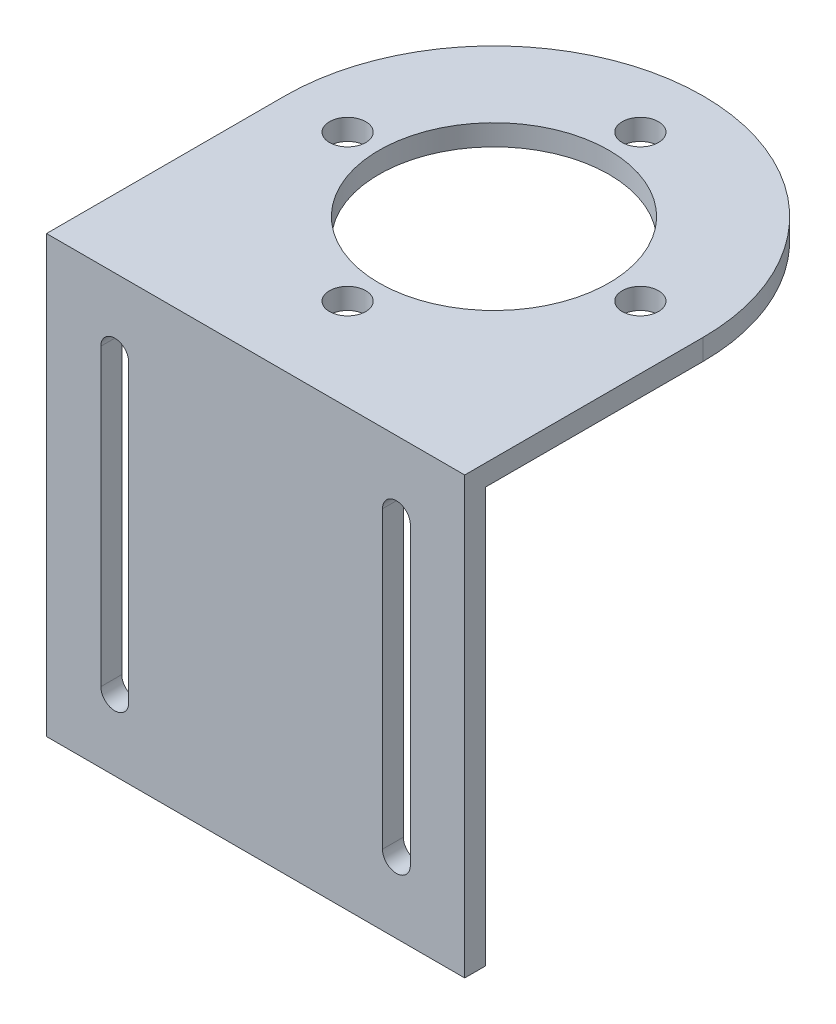
ISO-10303-21;
HEADER;
FILE_DESCRIPTION(('STEP AP214'),'2;1');
FILE_NAME('part.step','',(''),(''),'','','');
FILE_SCHEMA(('AUTOMOTIVE_DESIGN { 1 0 10303 214 1 1 1 1 }'));
ENDSEC;
DATA;
#1=APPLICATION_CONTEXT('core data for automotive mechanical design processes');
#2=APPLICATION_PROTOCOL_DEFINITION('international standard','automotive_design',2000,#1);
#3=PRODUCT_CONTEXT('',#1,'mechanical');
#4=PRODUCT('Part','Part','',(#3));
#5=PRODUCT_RELATED_PRODUCT_CATEGORY('part','',(#4));
#6=PRODUCT_DEFINITION_FORMATION('','',#4);
#7=PRODUCT_DEFINITION_CONTEXT('part definition',#1,'design');
#8=PRODUCT_DEFINITION('design','',#6,#7);
#9=PRODUCT_DEFINITION_SHAPE('','',#8);
#10=(LENGTH_UNIT() NAMED_UNIT(*) SI_UNIT(.MILLI.,.METRE.));
#11=(NAMED_UNIT(*) PLANE_ANGLE_UNIT() SI_UNIT($,.RADIAN.));
#12=(NAMED_UNIT(*) SI_UNIT($,.STERADIAN.) SOLID_ANGLE_UNIT());
#13=UNCERTAINTY_MEASURE_WITH_UNIT(LENGTH_MEASURE(1.E-05),#10,'distance_accuracy_value','');
#14=(GEOMETRIC_REPRESENTATION_CONTEXT(3) GLOBAL_UNCERTAINTY_ASSIGNED_CONTEXT((#13)) GLOBAL_UNIT_ASSIGNED_CONTEXT((#10,
#11,#12)) REPRESENTATION_CONTEXT('',''));
#15=CARTESIAN_POINT('',(0.,0.,0.));
#16=DIRECTION('',(0.,0.,1.));
#17=DIRECTION('',(1.,0.,0.));
#18=AXIS2_PLACEMENT_3D('',#15,#16,#17);
#19=CARTESIAN_POINT('',(30.,62.5,-31.2));
#20=DIRECTION('',(0.,1.,0.));
#21=DIRECTION('',(0.,0.,1.));
#22=AXIS2_PLACEMENT_3D('',#19,#20,#21);
#23=CYLINDRICAL_SURFACE('',#22,30.);
#24=DIRECTION('',(0.,-1.,0.));
#25=VECTOR('',#24,1.);
#26=CARTESIAN_POINT('',(0.,62.5,-31.2));
#27=LINE('',#26,#25);
#28=CARTESIAN_POINT('',(0.,62.5,-31.2));
#29=VERTEX_POINT('',#28);
#30=CARTESIAN_POINT('',(0.,59.5,-31.2));
#31=VERTEX_POINT('',#30);
#32=EDGE_CURVE('E178',#29,#31,#27,.T.);
#33=ORIENTED_EDGE('',*,*,#32,.F.);
#34=CARTESIAN_POINT('',(30.,62.5,-31.2));
#35=DIRECTION('',(0.,-1.,0.));
#36=DIRECTION('',(0.,0.,-1.));
#37=AXIS2_PLACEMENT_3D('',#34,#35,#36);
#38=CIRCLE('',#37,30.);
#39=CARTESIAN_POINT('',(60.,62.5,-31.2));
#40=VERTEX_POINT('',#39);
#41=EDGE_CURVE('E47',#40,#29,#38,.F.);
#42=ORIENTED_EDGE('',*,*,#41,.F.);
#43=DIRECTION('',(0.,-1.,0.));
#44=VECTOR('',#43,1.);
#45=CARTESIAN_POINT('',(60.,62.5,-31.2));
#46=LINE('',#45,#44);
#47=CARTESIAN_POINT('',(60.,59.5,-31.2));
#48=VERTEX_POINT('',#47);
#49=EDGE_CURVE('E181',#48,#40,#46,.F.);
#50=ORIENTED_EDGE('',*,*,#49,.F.);
#51=CARTESIAN_POINT('',(30.,59.5,-31.2));
#52=DIRECTION('',(0.,-1.,0.));
#53=DIRECTION('',(0.,0.,-1.));
#54=AXIS2_PLACEMENT_3D('',#51,#52,#53);
#55=CIRCLE('',#54,30.);
#56=EDGE_CURVE('E11',#31,#48,#55,.T.);
#57=ORIENTED_EDGE('',*,*,#56,.F.);
#58=EDGE_LOOP('',(#33,#42,#50,#57));
#59=FACE_BOUND('',#58,.T.);
#60=ADVANCED_FACE('F39',(#59),#23,.T.);
#61=CARTESIAN_POINT('',(0.,0.,3.));
#62=DIRECTION('',(0.,0.,-1.));
#63=DIRECTION('',(-1.,0.,0.));
#64=AXIS2_PLACEMENT_3D('',#61,#62,#63);
#65=PLANE('',#64);
#66=CARTESIAN_POINT('',(9.8,10.1,3.));
#67=DIRECTION('',(0.,0.,1.));
#68=DIRECTION('',(1.,0.,0.));
#69=AXIS2_PLACEMENT_3D('',#66,#67,#68);
#70=CIRCLE('',#69,2.);
#71=CARTESIAN_POINT('',(7.8,10.1,3.));
#72=VERTEX_POINT('',#71);
#73=CARTESIAN_POINT('',(11.8,10.1,3.));
#74=VERTEX_POINT('',#73);
#75=EDGE_CURVE('E219',#72,#74,#70,.T.);
#76=ORIENTED_EDGE('',*,*,#75,.F.);
#77=DIRECTION('',(0.,-1.,0.));
#78=VECTOR('',#77,1.);
#79=CARTESIAN_POINT('',(7.8,10.1,3.));
#80=LINE('',#79,#78);
#81=CARTESIAN_POINT('',(7.8,52.4,3.));
#82=VERTEX_POINT('',#81);
#83=EDGE_CURVE('E215',#82,#72,#80,.T.);
#84=ORIENTED_EDGE('',*,*,#83,.F.);
#85=CARTESIAN_POINT('',(9.8,52.4,3.));
#86=DIRECTION('',(0.,0.,1.));
#87=DIRECTION('',(1.,0.,0.));
#88=AXIS2_PLACEMENT_3D('',#85,#86,#87);
#89=CIRCLE('',#88,2.);
#90=CARTESIAN_POINT('',(11.8,52.4,3.));
#91=VERTEX_POINT('',#90);
#92=EDGE_CURVE('E230',#91,#82,#89,.T.);
#93=ORIENTED_EDGE('',*,*,#92,.F.);
#94=DIRECTION('',(0.,1.,0.));
#95=VECTOR('',#94,1.);
#96=CARTESIAN_POINT('',(11.8,10.1,3.));
#97=LINE('',#96,#95);
#98=EDGE_CURVE('E233',#74,#91,#97,.T.);
#99=ORIENTED_EDGE('',*,*,#98,.F.);
#100=EDGE_LOOP('',(#76,#84,#93,#99));
#101=FACE_BOUND('',#100,.T.);
#102=DIRECTION('',(0.,1.,0.));
#103=VECTOR('',#102,1.);
#104=CARTESIAN_POINT('',(60.,0.,3.));
#105=LINE('',#104,#103);
#106=CARTESIAN_POINT('',(60.,0.,3.));
#107=VERTEX_POINT('',#106);
#108=CARTESIAN_POINT('',(60.,62.5,3.));
#109=VERTEX_POINT('',#108);
#110=EDGE_CURVE('E197',#107,#109,#105,.T.);
#111=ORIENTED_EDGE('',*,*,#110,.T.);
#112=DIRECTION('',(-1.,0.,0.));
#113=VECTOR('',#112,1.);
#114=CARTESIAN_POINT('',(0.,62.5,3.));
#115=LINE('',#114,#113);
#116=CARTESIAN_POINT('',(0.,62.5,3.));
#117=VERTEX_POINT('',#116);
#118=EDGE_CURVE('E171',#109,#117,#115,.T.);
#119=ORIENTED_EDGE('',*,*,#118,.T.);
#120=DIRECTION('',(0.,-1.,0.));
#121=VECTOR('',#120,1.);
#122=CARTESIAN_POINT('',(0.,0.,3.));
#123=LINE('',#122,#121);
#124=CARTESIAN_POINT('',(0.,0.,3.));
#125=VERTEX_POINT('',#124);
#126=EDGE_CURVE('E159',#117,#125,#123,.T.);
#127=ORIENTED_EDGE('',*,*,#126,.T.);
#128=DIRECTION('',(1.,0.,0.));
#129=VECTOR('',#128,1.);
#130=CARTESIAN_POINT('',(0.,0.,3.));
#131=LINE('',#130,#129);
#132=EDGE_CURVE('E162',#125,#107,#131,.T.);
#133=ORIENTED_EDGE('',*,*,#132,.T.);
#134=EDGE_LOOP('',(#111,#119,#127,#133));
#135=FACE_BOUND('',#134,.T.);
#136=CARTESIAN_POINT('',(50.2,10.1,3.));
#137=DIRECTION('',(0.,0.,1.));
#138=DIRECTION('',(1.,0.,0.));
#139=AXIS2_PLACEMENT_3D('',#136,#137,#138);
#140=CIRCLE('',#139,2.);
#141=CARTESIAN_POINT('',(48.2,10.1,3.));
#142=VERTEX_POINT('',#141);
#143=CARTESIAN_POINT('',(52.2,10.1,3.));
#144=VERTEX_POINT('',#143);
#145=EDGE_CURVE('E249',#142,#144,#140,.T.);
#146=ORIENTED_EDGE('',*,*,#145,.F.);
#147=DIRECTION('',(0.,-1.,0.));
#148=VECTOR('',#147,1.);
#149=CARTESIAN_POINT('',(48.2,10.1,3.));
#150=LINE('',#149,#148);
#151=CARTESIAN_POINT('',(48.2,52.4,3.));
#152=VERTEX_POINT('',#151);
#153=EDGE_CURVE('E245',#152,#142,#150,.T.);
#154=ORIENTED_EDGE('',*,*,#153,.F.);
#155=CARTESIAN_POINT('',(50.2,52.4,3.));
#156=DIRECTION('',(0.,0.,1.));
#157=DIRECTION('',(1.,0.,0.));
#158=AXIS2_PLACEMENT_3D('',#155,#156,#157);
#159=CIRCLE('',#158,2.);
#160=CARTESIAN_POINT('',(52.2,52.4,3.));
#161=VERTEX_POINT('',#160);
#162=EDGE_CURVE('E259',#161,#152,#159,.T.);
#163=ORIENTED_EDGE('',*,*,#162,.F.);
#164=DIRECTION('',(0.,1.,0.));
#165=VECTOR('',#164,1.);
#166=CARTESIAN_POINT('',(52.2,10.1,3.));
#167=LINE('',#166,#165);
#168=EDGE_CURVE('E262',#144,#161,#167,.T.);
#169=ORIENTED_EDGE('',*,*,#168,.F.);
#170=EDGE_LOOP('',(#146,#154,#163,#169));
#171=FACE_BOUND('',#170,.T.);
#172=ADVANCED_FACE('F193',(#101,#135,#171),#65,.F.);
#173=CARTESIAN_POINT('',(0.,0.,0.));
#174=DIRECTION('',(0.,0.,-1.));
#175=DIRECTION('',(-1.,0.,0.));
#176=AXIS2_PLACEMENT_3D('',#173,#174,#175);
#177=PLANE('',#176);
#178=DIRECTION('',(-1.,0.,0.));
#179=VECTOR('',#178,1.);
#180=CARTESIAN_POINT('',(0.,59.5,0.));
#181=LINE('',#180,#179);
#182=CARTESIAN_POINT('',(60.,59.5,0.));
#183=VERTEX_POINT('',#182);
#184=CARTESIAN_POINT('',(0.,59.5,0.));
#185=VERTEX_POINT('',#184);
#186=EDGE_CURVE('E139',#183,#185,#181,.T.);
#187=ORIENTED_EDGE('',*,*,#186,.F.);
#188=DIRECTION('',(0.,1.,0.));
#189=VECTOR('',#188,1.);
#190=CARTESIAN_POINT('',(60.,0.,0.));
#191=LINE('',#190,#189);
#192=CARTESIAN_POINT('',(60.,0.,0.));
#193=VERTEX_POINT('',#192);
#194=EDGE_CURVE('E150',#193,#183,#191,.T.);
#195=ORIENTED_EDGE('',*,*,#194,.F.);
#196=DIRECTION('',(1.,0.,0.));
#197=VECTOR('',#196,1.);
#198=CARTESIAN_POINT('',(0.,0.,0.));
#199=LINE('',#198,#197);
#200=CARTESIAN_POINT('',(0.,0.,0.));
#201=VERTEX_POINT('',#200);
#202=EDGE_CURVE('E160',#201,#193,#199,.T.);
#203=ORIENTED_EDGE('',*,*,#202,.F.);
#204=DIRECTION('',(0.,-1.,0.));
#205=VECTOR('',#204,1.);
#206=CARTESIAN_POINT('',(0.,0.,0.));
#207=LINE('',#206,#205);
#208=EDGE_CURVE('E151',#185,#201,#207,.T.);
#209=ORIENTED_EDGE('',*,*,#208,.F.);
#210=EDGE_LOOP('',(#187,#195,#203,#209));
#211=FACE_BOUND('',#210,.T.);
#212=DIRECTION('',(0.,-1.,0.));
#213=VECTOR('',#212,1.);
#214=CARTESIAN_POINT('',(7.8,10.1,0.));
#215=LINE('',#214,#213);
#216=CARTESIAN_POINT('',(7.8,52.4,0.));
#217=VERTEX_POINT('',#216);
#218=CARTESIAN_POINT('',(7.8,10.1,0.));
#219=VERTEX_POINT('',#218);
#220=EDGE_CURVE('E216',#217,#219,#215,.T.);
#221=ORIENTED_EDGE('',*,*,#220,.T.);
#222=CARTESIAN_POINT('',(9.8,10.1,0.));
#223=DIRECTION('',(0.,0.,1.));
#224=DIRECTION('',(1.,0.,0.));
#225=AXIS2_PLACEMENT_3D('',#222,#223,#224);
#226=CIRCLE('',#225,2.);
#227=CARTESIAN_POINT('',(11.8,10.1,0.));
#228=VERTEX_POINT('',#227);
#229=EDGE_CURVE('E226',#219,#228,#226,.T.);
#230=ORIENTED_EDGE('',*,*,#229,.T.);
#231=DIRECTION('',(0.,1.,0.));
#232=VECTOR('',#231,1.);
#233=CARTESIAN_POINT('',(11.8,10.1,0.));
#234=LINE('',#233,#232);
#235=CARTESIAN_POINT('',(11.8,52.4,0.));
#236=VERTEX_POINT('',#235);
#237=EDGE_CURVE('E223',#228,#236,#234,.T.);
#238=ORIENTED_EDGE('',*,*,#237,.T.);
#239=CARTESIAN_POINT('',(9.8,52.4,0.));
#240=DIRECTION('',(0.,0.,1.));
#241=DIRECTION('',(1.,0.,0.));
#242=AXIS2_PLACEMENT_3D('',#239,#240,#241);
#243=CIRCLE('',#242,2.);
#244=EDGE_CURVE('E220',#236,#217,#243,.T.);
#245=ORIENTED_EDGE('',*,*,#244,.T.);
#246=EDGE_LOOP('',(#221,#230,#238,#245));
#247=FACE_BOUND('',#246,.T.);
#248=DIRECTION('',(0.,-1.,0.));
#249=VECTOR('',#248,1.);
#250=CARTESIAN_POINT('',(48.2,10.1,0.));
#251=LINE('',#250,#249);
#252=CARTESIAN_POINT('',(48.2,52.4,0.));
#253=VERTEX_POINT('',#252);
#254=CARTESIAN_POINT('',(48.2,10.1,0.));
#255=VERTEX_POINT('',#254);
#256=EDGE_CURVE('E246',#253,#255,#251,.T.);
#257=ORIENTED_EDGE('',*,*,#256,.T.);
#258=CARTESIAN_POINT('',(50.2,10.1,0.));
#259=DIRECTION('',(0.,0.,1.));
#260=DIRECTION('',(1.,0.,0.));
#261=AXIS2_PLACEMENT_3D('',#258,#259,#260);
#262=CIRCLE('',#261,2.);
#263=CARTESIAN_POINT('',(52.2,10.1,0.));
#264=VERTEX_POINT('',#263);
#265=EDGE_CURVE('E152',#255,#264,#262,.T.);
#266=ORIENTED_EDGE('',*,*,#265,.T.);
#267=DIRECTION('',(0.,1.,0.));
#268=VECTOR('',#267,1.);
#269=CARTESIAN_POINT('',(52.2,10.1,0.));
#270=LINE('',#269,#268);
#271=CARTESIAN_POINT('',(52.2,52.4,0.));
#272=VERTEX_POINT('',#271);
#273=EDGE_CURVE('E253',#264,#272,#270,.T.);
#274=ORIENTED_EDGE('',*,*,#273,.T.);
#275=CARTESIAN_POINT('',(50.2,52.4,0.));
#276=DIRECTION('',(0.,0.,1.));
#277=DIRECTION('',(1.,0.,0.));
#278=AXIS2_PLACEMENT_3D('',#275,#276,#277);
#279=CIRCLE('',#278,2.);
#280=EDGE_CURVE('E250',#272,#253,#279,.T.);
#281=ORIENTED_EDGE('',*,*,#280,.T.);
#282=EDGE_LOOP('',(#257,#266,#274,#281));
#283=FACE_BOUND('',#282,.T.);
#284=ADVANCED_FACE('F147',(#211,#247,#283),#177,.T.);
#285=CARTESIAN_POINT('',(0.,0.,3.));
#286=DIRECTION('',(1.,0.,0.));
#287=DIRECTION('',(0.,0.,-1.));
#288=AXIS2_PLACEMENT_3D('',#285,#286,#287);
#289=PLANE('',#288);
#290=DIRECTION('',(0.,0.,-1.));
#291=VECTOR('',#290,1.);
#292=CARTESIAN_POINT('',(0.,62.5,3.));
#293=LINE('',#292,#291);
#294=EDGE_CURVE('E167',#117,#29,#293,.T.);
#295=ORIENTED_EDGE('',*,*,#294,.T.);
#296=ORIENTED_EDGE('',*,*,#32,.T.);
#297=DIRECTION('',(0.,0.,1.));
#298=VECTOR('',#297,1.);
#299=CARTESIAN_POINT('',(0.,59.5,3.));
#300=LINE('',#299,#298);
#301=EDGE_CURVE('E143',#31,#185,#300,.T.);
#302=ORIENTED_EDGE('',*,*,#301,.T.);
#303=ORIENTED_EDGE('',*,*,#208,.T.);
#304=DIRECTION('',(0.,0.,-1.));
#305=VECTOR('',#304,1.);
#306=CARTESIAN_POINT('',(0.,0.,3.));
#307=LINE('',#306,#305);
#308=EDGE_CURVE('E175',#125,#201,#307,.T.);
#309=ORIENTED_EDGE('',*,*,#308,.F.);
#310=ORIENTED_EDGE('',*,*,#126,.F.);
#311=EDGE_LOOP('',(#295,#296,#302,#303,#309,#310));
#312=FACE_BOUND('',#311,.T.);
#313=ADVANCED_FACE('F189',(#312),#289,.F.);
#314=CARTESIAN_POINT('',(0.,0.,3.));
#315=DIRECTION('',(0.,1.,0.));
#316=DIRECTION('',(0.,0.,1.));
#317=AXIS2_PLACEMENT_3D('',#314,#315,#316);
#318=PLANE('',#317);
#319=ORIENTED_EDGE('',*,*,#202,.T.);
#320=DIRECTION('',(0.,0.,-1.));
#321=VECTOR('',#320,1.);
#322=CARTESIAN_POINT('',(60.,0.,3.));
#323=LINE('',#322,#321);
#324=EDGE_CURVE('E158',#107,#193,#323,.T.);
#325=ORIENTED_EDGE('',*,*,#324,.F.);
#326=ORIENTED_EDGE('',*,*,#132,.F.);
#327=ORIENTED_EDGE('',*,*,#308,.T.);
#328=EDGE_LOOP('',(#319,#325,#326,#327));
#329=FACE_BOUND('',#328,.T.);
#330=ADVANCED_FACE('F196',(#329),#318,.F.);
#331=CARTESIAN_POINT('',(60.,0.,3.));
#332=DIRECTION('',(-1.,0.,0.));
#333=DIRECTION('',(0.,0.,1.));
#334=AXIS2_PLACEMENT_3D('',#331,#332,#333);
#335=PLANE('',#334);
#336=DIRECTION('',(0.,0.,-1.));
#337=VECTOR('',#336,1.);
#338=CARTESIAN_POINT('',(60.,59.5,3.));
#339=LINE('',#338,#337);
#340=EDGE_CURVE('E136',#183,#48,#339,.T.);
#341=ORIENTED_EDGE('',*,*,#340,.T.);
#342=ORIENTED_EDGE('',*,*,#49,.T.);
#343=DIRECTION('',(0.,0.,-1.));
#344=VECTOR('',#343,1.);
#345=CARTESIAN_POINT('',(60.,62.5,3.));
#346=LINE('',#345,#344);
#347=EDGE_CURVE('E170',#109,#40,#346,.T.);
#348=ORIENTED_EDGE('',*,*,#347,.F.);
#349=ORIENTED_EDGE('',*,*,#110,.F.);
#350=ORIENTED_EDGE('',*,*,#324,.T.);
#351=ORIENTED_EDGE('',*,*,#194,.T.);
#352=EDGE_LOOP('',(#341,#342,#348,#349,#350,#351));
#353=FACE_BOUND('',#352,.T.);
#354=ADVANCED_FACE('F155',(#353),#335,.F.);
#355=CARTESIAN_POINT('',(0.,62.5,3.));
#356=DIRECTION('',(0.,-1.,0.));
#357=DIRECTION('',(0.,0.,-1.));
#358=AXIS2_PLACEMENT_3D('',#355,#356,#357);
#359=PLANE('',#358);
#360=CARTESIAN_POINT('',(30.,62.5,-52.2));
#361=DIRECTION('',(0.,1.,0.));
#362=DIRECTION('',(0.,0.,1.));
#363=AXIS2_PLACEMENT_3D('',#360,#361,#362);
#364=CIRCLE('',#363,2.6);
#365=CARTESIAN_POINT('',(30.,62.5,-49.6));
#366=VERTEX_POINT('',#365);
#367=EDGE_CURVE('E280',#366,#366,#364,.T.);
#368=ORIENTED_EDGE('',*,*,#367,.F.);
#369=EDGE_LOOP('',(#368));
#370=FACE_BOUND('',#369,.T.);
#371=CARTESIAN_POINT('',(51.0000000000003,62.5,-31.2000000000002));
#372=DIRECTION('',(0.,1.,0.));
#373=DIRECTION('',(0.,0.,1.));
#374=AXIS2_PLACEMENT_3D('',#371,#372,#373);
#375=CIRCLE('',#374,2.6);
#376=CARTESIAN_POINT('',(51.0000000000003,62.5,-28.6000000000002));
#377=VERTEX_POINT('',#376);
#378=EDGE_CURVE('E273',#377,#377,#375,.T.);
#379=ORIENTED_EDGE('',*,*,#378,.F.);
#380=EDGE_LOOP('',(#379));
#381=FACE_BOUND('',#380,.T.);
#382=CARTESIAN_POINT('',(30.0000000000004,62.5,-10.2));
#383=DIRECTION('',(0.,1.,0.));
#384=DIRECTION('',(0.,0.,1.));
#385=AXIS2_PLACEMENT_3D('',#382,#383,#384);
#386=CIRCLE('',#385,2.59999999999999);
#387=CARTESIAN_POINT('',(30.0000000000004,62.5,-7.60000000000001));
#388=VERTEX_POINT('',#387);
#389=EDGE_CURVE('E291',#388,#388,#386,.T.);
#390=ORIENTED_EDGE('',*,*,#389,.F.);
#391=EDGE_LOOP('',(#390));
#392=FACE_BOUND('',#391,.T.);
#393=CARTESIAN_POINT('',(9.00000000000029,62.5,-31.1999999999999));
#394=DIRECTION('',(0.,1.,0.));
#395=DIRECTION('',(0.,0.,1.));
#396=AXIS2_PLACEMENT_3D('',#393,#394,#395);
#397=CIRCLE('',#396,2.59999999999999);
#398=CARTESIAN_POINT('',(9.00000000000029,62.5,-28.5999999999999));
#399=VERTEX_POINT('',#398);
#400=EDGE_CURVE('E285',#399,#399,#397,.T.);
#401=ORIENTED_EDGE('',*,*,#400,.F.);
#402=EDGE_LOOP('',(#401));
#403=FACE_BOUND('',#402,.T.);
#404=CARTESIAN_POINT('',(30.,62.5,-31.2));
#405=DIRECTION('',(0.,1.,0.));
#406=DIRECTION('',(0.,0.,1.));
#407=AXIS2_PLACEMENT_3D('',#404,#405,#406);
#408=CIRCLE('',#407,16.5);
#409=CARTESIAN_POINT('',(30.,62.5,-14.7));
#410=VERTEX_POINT('',#409);
#411=EDGE_CURVE('E267',#410,#410,#408,.T.);
#412=ORIENTED_EDGE('',*,*,#411,.F.);
#413=EDGE_LOOP('',(#412));
#414=FACE_BOUND('',#413,.T.);
#415=ORIENTED_EDGE('',*,*,#347,.T.);
#416=ORIENTED_EDGE('',*,*,#41,.T.);
#417=ORIENTED_EDGE('',*,*,#294,.F.);
#418=ORIENTED_EDGE('',*,*,#118,.F.);
#419=EDGE_LOOP('',(#415,#416,#417,#418));
#420=FACE_BOUND('',#419,.T.);
#421=ADVANCED_FACE('F184',(#370,#381,#392,#403,#414,#420),#359,.F.);
#422=CARTESIAN_POINT('',(9.8,10.1,3.));
#423=DIRECTION('',(0.,0.,-1.));
#424=DIRECTION('',(-1.,0.,0.));
#425=AXIS2_PLACEMENT_3D('',#422,#423,#424);
#426=CYLINDRICAL_SURFACE('',#425,2.);
#427=ORIENTED_EDGE('',*,*,#229,.F.);
#428=DIRECTION('',(0.,0.,-1.));
#429=VECTOR('',#428,1.);
#430=CARTESIAN_POINT('',(7.8,10.1,3.));
#431=LINE('',#430,#429);
#432=EDGE_CURVE('E212',#72,#219,#431,.T.);
#433=ORIENTED_EDGE('',*,*,#432,.F.);
#434=ORIENTED_EDGE('',*,*,#75,.T.);
#435=DIRECTION('',(0.,0.,-1.));
#436=VECTOR('',#435,1.);
#437=CARTESIAN_POINT('',(11.8,10.1,3.));
#438=LINE('',#437,#436);
#439=EDGE_CURVE('E202',#74,#228,#438,.T.);
#440=ORIENTED_EDGE('',*,*,#439,.T.);
#441=EDGE_LOOP('',(#427,#433,#434,#440));
#442=FACE_BOUND('',#441,.T.);
#443=ADVANCED_FACE('F309',(#442),#426,.F.);
#444=CARTESIAN_POINT('',(11.8,10.1,3.));
#445=DIRECTION('',(-1.,0.,0.));
#446=DIRECTION('',(0.,0.,1.));
#447=AXIS2_PLACEMENT_3D('',#444,#445,#446);
#448=PLANE('',#447);
#449=ORIENTED_EDGE('',*,*,#237,.F.);
#450=ORIENTED_EDGE('',*,*,#439,.F.);
#451=ORIENTED_EDGE('',*,*,#98,.T.);
#452=DIRECTION('',(0.,0.,-1.));
#453=VECTOR('',#452,1.);
#454=CARTESIAN_POINT('',(11.8,52.4,3.));
#455=LINE('',#454,#453);
#456=EDGE_CURVE('E204',#91,#236,#455,.T.);
#457=ORIENTED_EDGE('',*,*,#456,.T.);
#458=EDGE_LOOP('',(#449,#450,#451,#457));
#459=FACE_BOUND('',#458,.T.);
#460=ADVANCED_FACE('F372',(#459),#448,.T.);
#461=CARTESIAN_POINT('',(9.8,52.4,3.));
#462=DIRECTION('',(0.,0.,-1.));
#463=DIRECTION('',(-1.,0.,0.));
#464=AXIS2_PLACEMENT_3D('',#461,#462,#463);
#465=CYLINDRICAL_SURFACE('',#464,2.);
#466=ORIENTED_EDGE('',*,*,#244,.F.);
#467=ORIENTED_EDGE('',*,*,#456,.F.);
#468=ORIENTED_EDGE('',*,*,#92,.T.);
#469=DIRECTION('',(0.,0.,-1.));
#470=VECTOR('',#469,1.);
#471=CARTESIAN_POINT('',(7.8,52.4,3.));
#472=LINE('',#471,#470);
#473=EDGE_CURVE('E208',#82,#217,#472,.T.);
#474=ORIENTED_EDGE('',*,*,#473,.T.);
#475=EDGE_LOOP('',(#466,#467,#468,#474));
#476=FACE_BOUND('',#475,.T.);
#477=ADVANCED_FACE('F378',(#476),#465,.F.);
#478=CARTESIAN_POINT('',(7.8,10.1,3.));
#479=DIRECTION('',(1.,0.,0.));
#480=DIRECTION('',(0.,0.,-1.));
#481=AXIS2_PLACEMENT_3D('',#478,#479,#480);
#482=PLANE('',#481);
#483=ORIENTED_EDGE('',*,*,#220,.F.);
#484=ORIENTED_EDGE('',*,*,#473,.F.);
#485=ORIENTED_EDGE('',*,*,#83,.T.);
#486=ORIENTED_EDGE('',*,*,#432,.T.);
#487=EDGE_LOOP('',(#483,#484,#485,#486));
#488=FACE_BOUND('',#487,.T.);
#489=ADVANCED_FACE('F385',(#488),#482,.T.);
#490=CARTESIAN_POINT('',(50.2,10.1,3.));
#491=DIRECTION('',(0.,0.,-1.));
#492=DIRECTION('',(-1.,0.,0.));
#493=AXIS2_PLACEMENT_3D('',#490,#491,#492);
#494=CYLINDRICAL_SURFACE('',#493,2.);
#495=ORIENTED_EDGE('',*,*,#265,.F.);
#496=DIRECTION('',(0.,0.,-1.));
#497=VECTOR('',#496,1.);
#498=CARTESIAN_POINT('',(48.2,10.1,3.));
#499=LINE('',#498,#497);
#500=EDGE_CURVE('E242',#142,#255,#499,.T.);
#501=ORIENTED_EDGE('',*,*,#500,.F.);
#502=ORIENTED_EDGE('',*,*,#145,.T.);
#503=DIRECTION('',(0.,0.,-1.));
#504=VECTOR('',#503,1.);
#505=CARTESIAN_POINT('',(52.2,10.1,3.));
#506=LINE('',#505,#504);
#507=EDGE_CURVE('E228',#144,#264,#506,.T.);
#508=ORIENTED_EDGE('',*,*,#507,.T.);
#509=EDGE_LOOP('',(#495,#501,#502,#508));
#510=FACE_BOUND('',#509,.T.);
#511=ADVANCED_FACE('F393',(#510),#494,.F.);
#512=CARTESIAN_POINT('',(52.2,10.1,3.));
#513=DIRECTION('',(-1.,0.,0.));
#514=DIRECTION('',(0.,0.,1.));
#515=AXIS2_PLACEMENT_3D('',#512,#513,#514);
#516=PLANE('',#515);
#517=ORIENTED_EDGE('',*,*,#273,.F.);
#518=ORIENTED_EDGE('',*,*,#507,.F.);
#519=ORIENTED_EDGE('',*,*,#168,.T.);
#520=DIRECTION('',(0.,0.,-1.));
#521=VECTOR('',#520,1.);
#522=CARTESIAN_POINT('',(52.2,52.4,3.));
#523=LINE('',#522,#521);
#524=EDGE_CURVE('E238',#161,#272,#523,.T.);
#525=ORIENTED_EDGE('',*,*,#524,.T.);
#526=EDGE_LOOP('',(#517,#518,#519,#525));
#527=FACE_BOUND('',#526,.T.);
#528=ADVANCED_FACE('F401',(#527),#516,.T.);
#529=CARTESIAN_POINT('',(50.2,52.4,3.));
#530=DIRECTION('',(0.,0.,-1.));
#531=DIRECTION('',(-1.,0.,0.));
#532=AXIS2_PLACEMENT_3D('',#529,#530,#531);
#533=CYLINDRICAL_SURFACE('',#532,2.);
#534=ORIENTED_EDGE('',*,*,#280,.F.);
#535=ORIENTED_EDGE('',*,*,#524,.F.);
#536=ORIENTED_EDGE('',*,*,#162,.T.);
#537=DIRECTION('',(0.,0.,-1.));
#538=VECTOR('',#537,1.);
#539=CARTESIAN_POINT('',(48.2,52.4,3.));
#540=LINE('',#539,#538);
#541=EDGE_CURVE('E240',#152,#253,#540,.T.);
#542=ORIENTED_EDGE('',*,*,#541,.T.);
#543=EDGE_LOOP('',(#534,#535,#536,#542));
#544=FACE_BOUND('',#543,.T.);
#545=ADVANCED_FACE('F409',(#544),#533,.F.);
#546=CARTESIAN_POINT('',(48.2,10.1,3.));
#547=DIRECTION('',(1.,0.,0.));
#548=DIRECTION('',(0.,0.,-1.));
#549=AXIS2_PLACEMENT_3D('',#546,#547,#548);
#550=PLANE('',#549);
#551=ORIENTED_EDGE('',*,*,#256,.F.);
#552=ORIENTED_EDGE('',*,*,#541,.F.);
#553=ORIENTED_EDGE('',*,*,#153,.T.);
#554=ORIENTED_EDGE('',*,*,#500,.T.);
#555=EDGE_LOOP('',(#551,#552,#553,#554));
#556=FACE_BOUND('',#555,.T.);
#557=ADVANCED_FACE('F326',(#556),#550,.T.);
#558=CARTESIAN_POINT('',(0.,59.5,0.));
#559=DIRECTION('',(0.,-1.,0.));
#560=DIRECTION('',(0.,0.,-1.));
#561=AXIS2_PLACEMENT_3D('',#558,#559,#560);
#562=PLANE('',#561);
#563=CARTESIAN_POINT('',(30.,59.5,-52.2));
#564=DIRECTION('',(0.,1.,0.));
#565=DIRECTION('',(0.,0.,1.));
#566=AXIS2_PLACEMENT_3D('',#563,#564,#565);
#567=CIRCLE('',#566,2.6);
#568=CARTESIAN_POINT('',(30.,59.5,-49.6));
#569=VERTEX_POINT('',#568);
#570=EDGE_CURVE('E270',#569,#569,#567,.T.);
#571=ORIENTED_EDGE('',*,*,#570,.T.);
#572=EDGE_LOOP('',(#571));
#573=FACE_BOUND('',#572,.T.);
#574=CARTESIAN_POINT('',(51.0000000000003,59.5,-31.2000000000002));
#575=DIRECTION('',(0.,1.,0.));
#576=DIRECTION('',(0.,0.,1.));
#577=AXIS2_PLACEMENT_3D('',#574,#575,#576);
#578=CIRCLE('',#577,2.6);
#579=CARTESIAN_POINT('',(51.0000000000003,59.5,-28.6000000000002));
#580=VERTEX_POINT('',#579);
#581=EDGE_CURVE('E276',#580,#580,#578,.T.);
#582=ORIENTED_EDGE('',*,*,#581,.T.);
#583=EDGE_LOOP('',(#582));
#584=FACE_BOUND('',#583,.T.);
#585=CARTESIAN_POINT('',(30.0000000000004,59.5,-10.2));
#586=DIRECTION('',(0.,1.,0.));
#587=DIRECTION('',(0.,0.,1.));
#588=AXIS2_PLACEMENT_3D('',#585,#586,#587);
#589=CIRCLE('',#588,2.59999999999999);
#590=CARTESIAN_POINT('',(30.0000000000004,59.5,-7.60000000000001));
#591=VERTEX_POINT('',#590);
#592=EDGE_CURVE('E277',#591,#591,#589,.T.);
#593=ORIENTED_EDGE('',*,*,#592,.T.);
#594=EDGE_LOOP('',(#593));
#595=FACE_BOUND('',#594,.T.);
#596=CARTESIAN_POINT('',(9.00000000000029,59.5,-31.1999999999999));
#597=DIRECTION('',(0.,1.,0.));
#598=DIRECTION('',(0.,0.,1.));
#599=AXIS2_PLACEMENT_3D('',#596,#597,#598);
#600=CIRCLE('',#599,2.59999999999999);
#601=CARTESIAN_POINT('',(9.00000000000029,59.5,-28.5999999999999));
#602=VERTEX_POINT('',#601);
#603=EDGE_CURVE('E288',#602,#602,#600,.T.);
#604=ORIENTED_EDGE('',*,*,#603,.T.);
#605=EDGE_LOOP('',(#604));
#606=FACE_BOUND('',#605,.T.);
#607=CARTESIAN_POINT('',(30.,59.5,-31.2));
#608=DIRECTION('',(0.,1.,0.));
#609=DIRECTION('',(0.,0.,1.));
#610=AXIS2_PLACEMENT_3D('',#607,#608,#609);
#611=CIRCLE('',#610,16.5);
#612=CARTESIAN_POINT('',(30.,59.5,-14.7));
#613=VERTEX_POINT('',#612);
#614=EDGE_CURVE('E266',#613,#613,#611,.T.);
#615=ORIENTED_EDGE('',*,*,#614,.T.);
#616=EDGE_LOOP('',(#615));
#617=FACE_BOUND('',#616,.T.);
#618=ORIENTED_EDGE('',*,*,#301,.F.);
#619=ORIENTED_EDGE('',*,*,#56,.T.);
#620=ORIENTED_EDGE('',*,*,#340,.F.);
#621=ORIENTED_EDGE('',*,*,#186,.T.);
#622=EDGE_LOOP('',(#618,#619,#620,#621));
#623=FACE_BOUND('',#622,.T.);
#624=ADVANCED_FACE('F138',(#573,#584,#595,#606,#617,#623),#562,.T.);
#625=CARTESIAN_POINT('',(30.,59.5,-31.2));
#626=DIRECTION('',(0.,1.,0.));
#627=DIRECTION('',(0.,0.,1.));
#628=AXIS2_PLACEMENT_3D('',#625,#626,#627);
#629=CYLINDRICAL_SURFACE('',#628,16.5);
#630=ORIENTED_EDGE('',*,*,#614,.F.);
#631=EDGE_LOOP('',(#630));
#632=FACE_BOUND('',#631,.T.);
#633=ORIENTED_EDGE('',*,*,#411,.T.);
#634=EDGE_LOOP('',(#633));
#635=FACE_BOUND('',#634,.T.);
#636=ADVANCED_FACE('F316',(#632,#635),#629,.F.);
#637=CARTESIAN_POINT('',(9.00000000000029,59.5,-31.1999999999999));
#638=DIRECTION('',(0.,1.,0.));
#639=DIRECTION('',(0.,0.,1.));
#640=AXIS2_PLACEMENT_3D('',#637,#638,#639);
#641=CYLINDRICAL_SURFACE('',#640,2.59999999999999);
#642=ORIENTED_EDGE('',*,*,#603,.F.);
#643=EDGE_LOOP('',(#642));
#644=FACE_BOUND('',#643,.T.);
#645=ORIENTED_EDGE('',*,*,#400,.T.);
#646=EDGE_LOOP('',(#645));
#647=FACE_BOUND('',#646,.T.);
#648=ADVANCED_FACE('F303',(#644,#647),#641,.F.);
#649=CARTESIAN_POINT('',(30.0000000000004,59.5,-10.2));
#650=DIRECTION('',(0.,1.,0.));
#651=DIRECTION('',(0.,0.,1.));
#652=AXIS2_PLACEMENT_3D('',#649,#650,#651);
#653=CYLINDRICAL_SURFACE('',#652,2.59999999999999);
#654=ORIENTED_EDGE('',*,*,#592,.F.);
#655=EDGE_LOOP('',(#654));
#656=FACE_BOUND('',#655,.T.);
#657=ORIENTED_EDGE('',*,*,#389,.T.);
#658=EDGE_LOOP('',(#657));
#659=FACE_BOUND('',#658,.T.);
#660=ADVANCED_FACE('F299',(#656,#659),#653,.F.);
#661=CARTESIAN_POINT('',(51.0000000000003,59.5,-31.2000000000002));
#662=DIRECTION('',(0.,1.,0.));
#663=DIRECTION('',(0.,0.,1.));
#664=AXIS2_PLACEMENT_3D('',#661,#662,#663);
#665=CYLINDRICAL_SURFACE('',#664,2.6);
#666=ORIENTED_EDGE('',*,*,#581,.F.);
#667=EDGE_LOOP('',(#666));
#668=FACE_BOUND('',#667,.T.);
#669=ORIENTED_EDGE('',*,*,#378,.T.);
#670=EDGE_LOOP('',(#669));
#671=FACE_BOUND('',#670,.T.);
#672=ADVANCED_FACE('F302',(#668,#671),#665,.F.);
#673=CARTESIAN_POINT('',(30.,59.5,-52.2));
#674=DIRECTION('',(0.,1.,0.));
#675=DIRECTION('',(0.,0.,1.));
#676=AXIS2_PLACEMENT_3D('',#673,#674,#675);
#677=CYLINDRICAL_SURFACE('',#676,2.6);
#678=ORIENTED_EDGE('',*,*,#570,.F.);
#679=EDGE_LOOP('',(#678));
#680=FACE_BOUND('',#679,.T.);
#681=ORIENTED_EDGE('',*,*,#367,.T.);
#682=EDGE_LOOP('',(#681));
#683=FACE_BOUND('',#682,.T.);
#684=ADVANCED_FACE('F457',(#680,#683),#677,.F.);
#685=CLOSED_SHELL('',(#60,#172,#284,#313,#330,#354,#421,#443,#460,#477,#489,#511,#528,#545,#557,
#624,#636,#648,#660,#672,#684));
#686=MANIFOLD_SOLID_BREP('B2',#685);
#687=ADVANCED_BREP_SHAPE_REPRESENTATION('',(#18,#686),#14);
#688=SHAPE_DEFINITION_REPRESENTATION(#9,#687);
ENDSEC;
END-ISO-10303-21;
